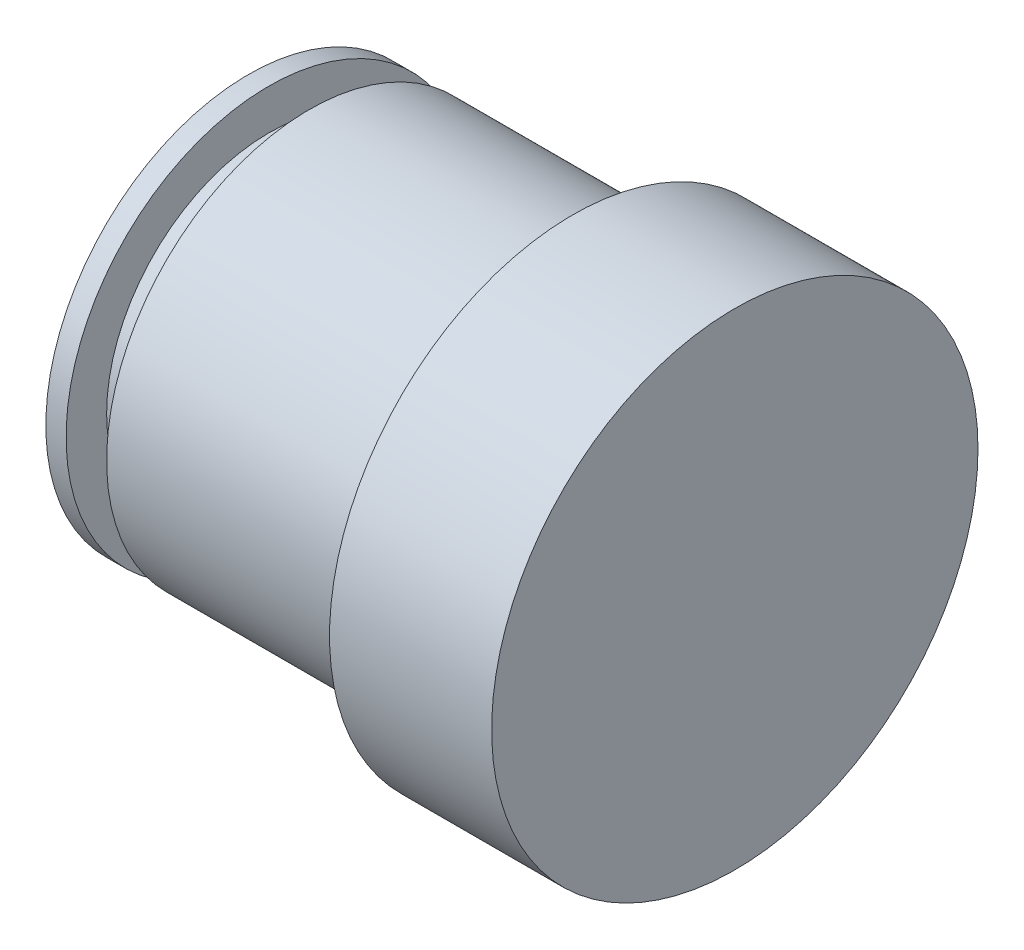
ISO-10303-21;
HEADER;
FILE_DESCRIPTION(('STEP AP214'),'2;1');
FILE_NAME('part.step','',(''),(''),'','','');
FILE_SCHEMA(('AUTOMOTIVE_DESIGN { 1 0 10303 214 1 1 1 1 }'));
ENDSEC;
DATA;
#1=APPLICATION_CONTEXT('core data for automotive mechanical design processes');
#2=APPLICATION_PROTOCOL_DEFINITION('international standard','automotive_design',2000,#1);
#3=PRODUCT_CONTEXT('',#1,'mechanical');
#4=PRODUCT('Part','Part','',(#3));
#5=PRODUCT_RELATED_PRODUCT_CATEGORY('part','',(#4));
#6=PRODUCT_DEFINITION_FORMATION('','',#4);
#7=PRODUCT_DEFINITION_CONTEXT('part definition',#1,'design');
#8=PRODUCT_DEFINITION('design','',#6,#7);
#9=PRODUCT_DEFINITION_SHAPE('','',#8);
#10=(LENGTH_UNIT() NAMED_UNIT(*) SI_UNIT(.MILLI.,.METRE.));
#11=(NAMED_UNIT(*) PLANE_ANGLE_UNIT() SI_UNIT($,.RADIAN.));
#12=(NAMED_UNIT(*) SI_UNIT($,.STERADIAN.) SOLID_ANGLE_UNIT());
#13=UNCERTAINTY_MEASURE_WITH_UNIT(LENGTH_MEASURE(1.E-05),#10,'distance_accuracy_value','');
#14=(GEOMETRIC_REPRESENTATION_CONTEXT(3) GLOBAL_UNCERTAINTY_ASSIGNED_CONTEXT((#13)) GLOBAL_UNIT_ASSIGNED_CONTEXT((#10,
#11,#12)) REPRESENTATION_CONTEXT('',''));
#15=CARTESIAN_POINT('',(0.,0.,0.));
#16=DIRECTION('',(0.,0.,1.));
#17=DIRECTION('',(1.,0.,0.));
#18=AXIS2_PLACEMENT_3D('',#15,#16,#17);
#19=CARTESIAN_POINT('',(0.,0.,0.));
#20=DIRECTION('',(-1.,0.,0.));
#21=DIRECTION('',(0.,0.,1.));
#22=AXIS2_PLACEMENT_3D('',#19,#20,#21);
#23=PLANE('',#22);
#24=CARTESIAN_POINT('',(0.,0.,0.));
#25=DIRECTION('',(1.,0.,0.));
#26=DIRECTION('',(0.,0.,-1.));
#27=AXIS2_PLACEMENT_3D('',#24,#25,#26);
#28=CIRCLE('',#27,5.);
#29=CARTESIAN_POINT('',(0.,0.,-5.));
#30=VERTEX_POINT('',#29);
#31=EDGE_CURVE('E10',#30,#30,#28,.T.);
#32=ORIENTED_EDGE('',*,*,#31,.F.);
#33=EDGE_LOOP('',(#32));
#34=FACE_BOUND('',#33,.T.);
#35=ADVANCED_FACE('F37',(#34),#23,.T.);
#36=CARTESIAN_POINT('',(12.,0.,0.));
#37=DIRECTION('',(1.,0.,0.));
#38=DIRECTION('',(0.,0.,-1.));
#39=AXIS2_PLACEMENT_3D('',#36,#37,#38);
#40=CYLINDRICAL_SURFACE('',#39,5.);
#41=ORIENTED_EDGE('',*,*,#31,.T.);
#42=EDGE_LOOP('',(#41));
#43=FACE_BOUND('',#42,.T.);
#44=CARTESIAN_POINT('',(0.5,0.,0.));
#45=DIRECTION('',(1.,0.,0.));
#46=DIRECTION('',(0.,0.,-1.));
#47=AXIS2_PLACEMENT_3D('',#44,#45,#46);
#48=CIRCLE('',#47,5.);
#49=CARTESIAN_POINT('',(0.5,0.,-5.));
#50=VERTEX_POINT('',#49);
#51=EDGE_CURVE('E44',#50,#50,#48,.T.);
#52=ORIENTED_EDGE('',*,*,#51,.F.);
#53=EDGE_LOOP('',(#52));
#54=FACE_BOUND('',#53,.T.);
#55=ADVANCED_FACE('F100',(#43,#54),#40,.T.);
#56=CARTESIAN_POINT('',(0.5,0.,-5.));
#57=DIRECTION('',(1.,0.,0.));
#58=DIRECTION('',(0.,0.,-1.));
#59=AXIS2_PLACEMENT_3D('',#56,#57,#58);
#60=PLANE('',#59);
#61=ORIENTED_EDGE('',*,*,#51,.T.);
#62=EDGE_LOOP('',(#61));
#63=FACE_BOUND('',#62,.T.);
#64=CARTESIAN_POINT('',(0.5,0.,0.));
#65=DIRECTION('',(1.,0.,0.));
#66=DIRECTION('',(0.,0.,-1.));
#67=AXIS2_PLACEMENT_3D('',#64,#65,#66);
#68=CIRCLE('',#67,4.);
#69=CARTESIAN_POINT('',(0.5,0.,-4.));
#70=VERTEX_POINT('',#69);
#71=EDGE_CURVE('E50',#70,#70,#68,.T.);
#72=ORIENTED_EDGE('',*,*,#71,.F.);
#73=EDGE_LOOP('',(#72));
#74=FACE_BOUND('',#73,.T.);
#75=ADVANCED_FACE('F105',(#63,#74),#60,.T.);
#76=CARTESIAN_POINT('',(12.,0.,0.));
#77=DIRECTION('',(1.,0.,0.));
#78=DIRECTION('',(0.,0.,-1.));
#79=AXIS2_PLACEMENT_3D('',#76,#77,#78);
#80=CYLINDRICAL_SURFACE('',#79,4.);
#81=ORIENTED_EDGE('',*,*,#71,.T.);
#82=EDGE_LOOP('',(#81));
#83=FACE_BOUND('',#82,.T.);
#84=CARTESIAN_POINT('',(1.5,0.,0.));
#85=DIRECTION('',(1.,0.,0.));
#86=DIRECTION('',(0.,0.,-1.));
#87=AXIS2_PLACEMENT_3D('',#84,#85,#86);
#88=CIRCLE('',#87,4.);
#89=CARTESIAN_POINT('',(1.5,0.,-4.));
#90=VERTEX_POINT('',#89);
#91=EDGE_CURVE('E56',#90,#90,#88,.T.);
#92=ORIENTED_EDGE('',*,*,#91,.F.);
#93=EDGE_LOOP('',(#92));
#94=FACE_BOUND('',#93,.T.);
#95=ADVANCED_FACE('F109',(#83,#94),#80,.T.);
#96=CARTESIAN_POINT('',(1.5,0.,-4.));
#97=DIRECTION('',(-1.,0.,0.));
#98=DIRECTION('',(0.,0.,1.));
#99=AXIS2_PLACEMENT_3D('',#96,#97,#98);
#100=PLANE('',#99);
#101=ORIENTED_EDGE('',*,*,#91,.T.);
#102=EDGE_LOOP('',(#101));
#103=FACE_BOUND('',#102,.T.);
#104=CARTESIAN_POINT('',(1.5,0.,0.));
#105=DIRECTION('',(1.,0.,0.));
#106=DIRECTION('',(0.,0.,-1.));
#107=AXIS2_PLACEMENT_3D('',#104,#105,#106);
#108=CIRCLE('',#107,5.);
#109=CARTESIAN_POINT('',(1.5,0.,-5.));
#110=VERTEX_POINT('',#109);
#111=EDGE_CURVE('E62',#110,#110,#108,.T.);
#112=ORIENTED_EDGE('',*,*,#111,.F.);
#113=EDGE_LOOP('',(#112));
#114=FACE_BOUND('',#113,.T.);
#115=ADVANCED_FACE('F115',(#103,#114),#100,.T.);
#116=CARTESIAN_POINT('',(12.,0.,0.));
#117=DIRECTION('',(1.,0.,0.));
#118=DIRECTION('',(0.,0.,-1.));
#119=AXIS2_PLACEMENT_3D('',#116,#117,#118);
#120=CYLINDRICAL_SURFACE('',#119,5.);
#121=ORIENTED_EDGE('',*,*,#111,.T.);
#122=EDGE_LOOP('',(#121));
#123=FACE_BOUND('',#122,.T.);
#124=CARTESIAN_POINT('',(7.5,0.,0.));
#125=DIRECTION('',(1.,0.,0.));
#126=DIRECTION('',(0.,0.,-1.));
#127=AXIS2_PLACEMENT_3D('',#124,#125,#126);
#128=CIRCLE('',#127,5.);
#129=CARTESIAN_POINT('',(7.5,0.,-5.));
#130=VERTEX_POINT('',#129);
#131=EDGE_CURVE('E66',#130,#130,#128,.T.);
#132=ORIENTED_EDGE('',*,*,#131,.F.);
#133=EDGE_LOOP('',(#132));
#134=FACE_BOUND('',#133,.T.);
#135=ADVANCED_FACE('F119',(#123,#134),#120,.T.);
#136=CARTESIAN_POINT('',(7.5,0.,0.));
#137=DIRECTION('',(1.,0.,0.));
#138=DIRECTION('',(0.,0.,-1.));
#139=AXIS2_PLACEMENT_3D('',#136,#137,#138);
#140=TOROIDAL_SURFACE('',#139,5.5,0.5);
#141=ORIENTED_EDGE('',*,*,#131,.T.);
#142=EDGE_LOOP('',(#141));
#143=FACE_BOUND('',#142,.T.);
#144=CARTESIAN_POINT('',(8.,0.,0.));
#145=DIRECTION('',(1.,0.,0.));
#146=DIRECTION('',(0.,0.,-1.));
#147=AXIS2_PLACEMENT_3D('',#144,#145,#146);
#148=CIRCLE('',#147,5.5);
#149=CARTESIAN_POINT('',(8.,0.,-5.5));
#150=VERTEX_POINT('',#149);
#151=EDGE_CURVE('E70',#150,#150,#148,.T.);
#152=ORIENTED_EDGE('',*,*,#151,.F.);
#153=EDGE_LOOP('',(#152));
#154=FACE_BOUND('',#153,.T.);
#155=ADVANCED_FACE('F96',(#143,#154),#140,.F.);
#156=CARTESIAN_POINT('',(8.,0.,-5.5));
#157=DIRECTION('',(-1.,0.,0.));
#158=DIRECTION('',(0.,0.,1.));
#159=AXIS2_PLACEMENT_3D('',#156,#157,#158);
#160=PLANE('',#159);
#161=ORIENTED_EDGE('',*,*,#151,.T.);
#162=EDGE_LOOP('',(#161));
#163=FACE_BOUND('',#162,.T.);
#164=CARTESIAN_POINT('',(8.,0.,0.));
#165=DIRECTION('',(1.,0.,0.));
#166=DIRECTION('',(0.,0.,-1.));
#167=AXIS2_PLACEMENT_3D('',#164,#165,#166);
#168=CIRCLE('',#167,6.);
#169=CARTESIAN_POINT('',(8.,0.,-6.));
#170=VERTEX_POINT('',#169);
#171=EDGE_CURVE('E74',#170,#170,#168,.T.);
#172=ORIENTED_EDGE('',*,*,#171,.F.);
#173=EDGE_LOOP('',(#172));
#174=FACE_BOUND('',#173,.T.);
#175=ADVANCED_FACE('F88',(#163,#174),#160,.T.);
#176=CARTESIAN_POINT('',(12.,0.,0.));
#177=DIRECTION('',(1.,0.,0.));
#178=DIRECTION('',(0.,0.,-1.));
#179=AXIS2_PLACEMENT_3D('',#176,#177,#178);
#180=CYLINDRICAL_SURFACE('',#179,6.);
#181=ORIENTED_EDGE('',*,*,#171,.T.);
#182=EDGE_LOOP('',(#181));
#183=FACE_BOUND('',#182,.T.);
#184=CARTESIAN_POINT('',(12.,0.,0.));
#185=DIRECTION('',(1.,0.,0.));
#186=DIRECTION('',(0.,0.,-1.));
#187=AXIS2_PLACEMENT_3D('',#184,#185,#186);
#188=CIRCLE('',#187,6.);
#189=CARTESIAN_POINT('',(12.,0.,-6.));
#190=VERTEX_POINT('',#189);
#191=EDGE_CURVE('E78',#190,#190,#188,.T.);
#192=ORIENTED_EDGE('',*,*,#191,.F.);
#193=EDGE_LOOP('',(#192));
#194=FACE_BOUND('',#193,.T.);
#195=ADVANCED_FACE('F86',(#183,#194),#180,.T.);
#196=CARTESIAN_POINT('',(12.,0.,-6.));
#197=DIRECTION('',(1.,0.,0.));
#198=DIRECTION('',(0.,0.,-1.));
#199=AXIS2_PLACEMENT_3D('',#196,#197,#198);
#200=PLANE('',#199);
#201=ORIENTED_EDGE('',*,*,#191,.T.);
#202=EDGE_LOOP('',(#201));
#203=FACE_BOUND('',#202,.T.);
#204=ADVANCED_FACE('F84',(#203),#200,.T.);
#205=CLOSED_SHELL('',(#35,#55,#75,#95,#115,#135,#155,#175,#195,#204));
#206=MANIFOLD_SOLID_BREP('B2',#205);
#207=ADVANCED_BREP_SHAPE_REPRESENTATION('',(#18,#206),#14);
#208=SHAPE_DEFINITION_REPRESENTATION(#9,#207);
ENDSEC;
END-ISO-10303-21;
